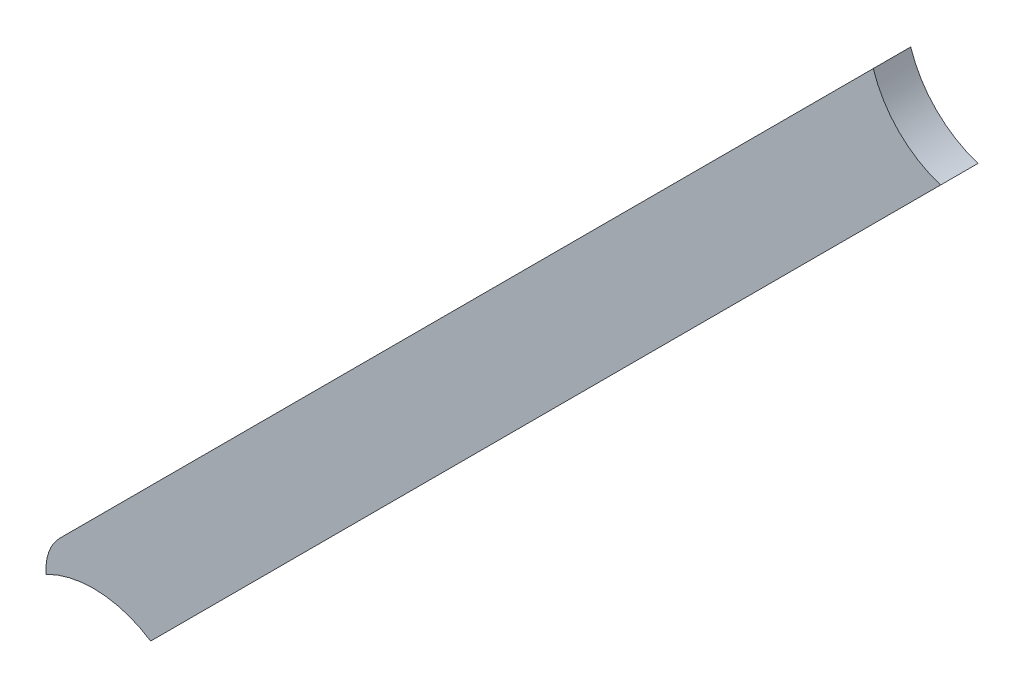
ISO-10303-21;
HEADER;
FILE_DESCRIPTION(('STEP AP214'),'2;1');
FILE_NAME('part.step','',(''),(''),'','','');
FILE_SCHEMA(('AUTOMOTIVE_DESIGN { 1 0 10303 214 1 1 1 1 }'));
ENDSEC;
DATA;
#1=APPLICATION_CONTEXT('core data for automotive mechanical design processes');
#2=APPLICATION_PROTOCOL_DEFINITION('international standard','automotive_design',2000,#1);
#3=PRODUCT_CONTEXT('',#1,'mechanical');
#4=PRODUCT('Part','Part','',(#3));
#5=PRODUCT_RELATED_PRODUCT_CATEGORY('part','',(#4));
#6=PRODUCT_DEFINITION_FORMATION('','',#4);
#7=PRODUCT_DEFINITION_CONTEXT('part definition',#1,'design');
#8=PRODUCT_DEFINITION('design','',#6,#7);
#9=PRODUCT_DEFINITION_SHAPE('','',#8);
#10=(LENGTH_UNIT() NAMED_UNIT(*) SI_UNIT(.MILLI.,.METRE.));
#11=(NAMED_UNIT(*) PLANE_ANGLE_UNIT() SI_UNIT($,.RADIAN.));
#12=(NAMED_UNIT(*) SI_UNIT($,.STERADIAN.) SOLID_ANGLE_UNIT());
#13=UNCERTAINTY_MEASURE_WITH_UNIT(LENGTH_MEASURE(1.E-05),#10,'distance_accuracy_value','');
#14=(GEOMETRIC_REPRESENTATION_CONTEXT(3) GLOBAL_UNCERTAINTY_ASSIGNED_CONTEXT((#13)) GLOBAL_UNIT_ASSIGNED_CONTEXT((#10,
#11,#12)) REPRESENTATION_CONTEXT('',''));
#15=CARTESIAN_POINT('',(0.,0.,0.));
#16=DIRECTION('',(0.,0.,1.));
#17=DIRECTION('',(1.,0.,0.));
#18=AXIS2_PLACEMENT_3D('',#15,#16,#17);
#19=CARTESIAN_POINT('',(109.397777606089,81.2328301260889,0.));
#20=DIRECTION('',(-0.707106781186546,0.707106781186549,0.));
#21=DIRECTION('',(0.707106781186549,0.707106781186546,0.));
#22=AXIS2_PLACEMENT_3D('',#19,#20,#21);
#23=PLANE('',#22);
#24=DIRECTION('',(0.707106781186549,0.707106781186546,0.));
#25=VECTOR('',#24,1.);
#26=CARTESIAN_POINT('',(109.27260594,81.10765846,0.1999996));
#27=LINE('',#26,#25);
#28=CARTESIAN_POINT('',(109.397777606089,81.2328301260889,0.1999996));
#29=VERTEX_POINT('',#28);
#30=CARTESIAN_POINT('',(113.615408458856,85.4504609788559,0.1999996));
#31=VERTEX_POINT('',#30);
#32=EDGE_CURVE('E11',#29,#31,#27,.T.);
#33=ORIENTED_EDGE('',*,*,#32,.F.);
#34=DIRECTION('',(0.,0.,1.));
#35=VECTOR('',#34,1.);
#36=CARTESIAN_POINT('',(109.397777606089,81.2328301260889,0.));
#37=LINE('',#36,#35);
#38=CARTESIAN_POINT('',(109.397777606089,81.2328301260889,0.));
#39=VERTEX_POINT('',#38);
#40=EDGE_CURVE('E24',#39,#29,#37,.T.);
#41=ORIENTED_EDGE('',*,*,#40,.F.);
#42=DIRECTION('',(0.707106781186549,0.707106781186546,0.));
#43=VECTOR('',#42,1.);
#44=CARTESIAN_POINT('',(109.27260594,81.10765846,0.));
#45=LINE('',#44,#43);
#46=CARTESIAN_POINT('',(113.615408458856,85.4504609788559,0.));
#47=VERTEX_POINT('',#46);
#48=EDGE_CURVE('E82',#39,#47,#45,.T.);
#49=ORIENTED_EDGE('',*,*,#48,.T.);
#50=DIRECTION('',(0.,0.,1.));
#51=VECTOR('',#50,1.);
#52=CARTESIAN_POINT('',(113.615408458856,85.4504609788559,0.));
#53=LINE('',#52,#51);
#54=EDGE_CURVE('E37',#47,#31,#53,.T.);
#55=ORIENTED_EDGE('',*,*,#54,.T.);
#56=EDGE_LOOP('',(#33,#41,#49,#55));
#57=FACE_BOUND('',#56,.T.);
#58=ADVANCED_FACE('F17',(#57),#23,.F.);
#59=CARTESIAN_POINT('',(113.7847356,85.979,0.));
#60=DIRECTION('',(0.,0.,-1.));
#61=DIRECTION('',(1.,0.,0.));
#62=AXIS2_PLACEMENT_3D('',#59,#60,#61);
#63=CYLINDRICAL_SURFACE('',#62,0.55500016);
#64=DIRECTION('',(0.,0.,1.));
#65=VECTOR('',#64,1.);
#66=CARTESIAN_POINT('',(113.256196578856,85.8096728588559,0.));
#67=LINE('',#66,#65);
#68=CARTESIAN_POINT('',(113.256196578856,85.8096728588559,0.));
#69=VERTEX_POINT('',#68);
#70=CARTESIAN_POINT('',(113.256196578856,85.8096728588559,0.1999996));
#71=VERTEX_POINT('',#70);
#72=EDGE_CURVE('E98',#69,#71,#67,.T.);
#73=ORIENTED_EDGE('',*,*,#72,.T.);
#74=CARTESIAN_POINT('',(113.7847356,85.979,0.1999996));
#75=DIRECTION('',(0.,0.,1.));
#76=DIRECTION('',(1.,0.,0.));
#77=AXIS2_PLACEMENT_3D('',#74,#75,#76);
#78=CIRCLE('',#77,0.55500016);
#79=EDGE_CURVE('E95',#71,#31,#78,.T.);
#80=ORIENTED_EDGE('',*,*,#79,.T.);
#81=ORIENTED_EDGE('',*,*,#54,.F.);
#82=CARTESIAN_POINT('',(113.7847356,85.979,0.));
#83=DIRECTION('',(0.,0.,1.));
#84=DIRECTION('',(1.,0.,0.));
#85=AXIS2_PLACEMENT_3D('',#82,#83,#84);
#86=CIRCLE('',#85,0.55500016);
#87=EDGE_CURVE('E93',#69,#47,#86,.T.);
#88=ORIENTED_EDGE('',*,*,#87,.F.);
#89=EDGE_LOOP('',(#73,#80,#81,#88));
#90=FACE_BOUND('',#89,.T.);
#91=ADVANCED_FACE('F103',(#90),#63,.F.);
#92=CARTESIAN_POINT('',(113.256196578856,85.8096728588559,0.));
#93=DIRECTION('',(0.707106781186545,-0.70710678118655,0.));
#94=DIRECTION('',(-0.70710678118655,-0.707106781186545,0.));
#95=AXIS2_PLACEMENT_3D('',#92,#93,#94);
#96=PLANE('',#95);
#97=DIRECTION('',(-0.70710678118655,-0.707106781186545,0.));
#98=VECTOR('',#97,1.);
#99=CARTESIAN_POINT('',(113.60512966,86.15860594,0.1999996));
#100=LINE('',#99,#98);
#101=CARTESIAN_POINT('',(108.91339406,81.46687034,0.1999996));
#102=VERTEX_POINT('',#101);
#103=EDGE_CURVE('E90',#71,#102,#100,.T.);
#104=ORIENTED_EDGE('',*,*,#103,.F.);
#105=ORIENTED_EDGE('',*,*,#72,.F.);
#106=DIRECTION('',(-0.70710678118655,-0.707106781186545,0.));
#107=VECTOR('',#106,1.);
#108=CARTESIAN_POINT('',(113.60512966,86.15860594,0.));
#109=LINE('',#108,#107);
#110=CARTESIAN_POINT('',(108.91339406,81.46687034,0.));
#111=VERTEX_POINT('',#110);
#112=EDGE_CURVE('E88',#69,#111,#109,.T.);
#113=ORIENTED_EDGE('',*,*,#112,.T.);
#114=DIRECTION('',(0.,0.,1.));
#115=VECTOR('',#114,1.);
#116=CARTESIAN_POINT('',(108.91339406,81.46687034,0.));
#117=LINE('',#116,#115);
#118=EDGE_CURVE('E73',#111,#102,#117,.T.);
#119=ORIENTED_EDGE('',*,*,#118,.T.);
#120=EDGE_LOOP('',(#104,#105,#113,#119));
#121=FACE_BOUND('',#120,.T.);
#122=ADVANCED_FACE('F109',(#121),#96,.F.);
#123=CARTESIAN_POINT('',(109.093,81.2872644,0.));
#124=DIRECTION('',(0.,0.,-1.));
#125=DIRECTION('',(-0.707106781186548,0.707106781186548,0.));
#126=AXIS2_PLACEMENT_3D('',#123,#124,#125);
#127=CYLINDRICAL_SURFACE('',#126,0.254001156230771);
#128=CARTESIAN_POINT('',(109.093,81.2872644,0.1999996));
#129=DIRECTION('',(0.,0.,1.));
#130=DIRECTION('',(-0.707106781186548,0.707106781186548,0.));
#131=AXIS2_PLACEMENT_3D('',#128,#129,#130);
#132=CIRCLE('',#131,0.254001156230771);
#133=CARTESIAN_POINT('',(108.840154544534,81.2630618584639,0.1999996));
#134=VERTEX_POINT('',#133);
#135=EDGE_CURVE('E77',#102,#134,#132,.T.);
#136=ORIENTED_EDGE('',*,*,#135,.F.);
#137=ORIENTED_EDGE('',*,*,#118,.F.);
#138=CARTESIAN_POINT('',(109.093,81.2872644,0.));
#139=DIRECTION('',(0.,0.,1.));
#140=DIRECTION('',(-0.707106781186548,0.707106781186548,0.));
#141=AXIS2_PLACEMENT_3D('',#138,#139,#140);
#142=CIRCLE('',#141,0.254001156230771);
#143=CARTESIAN_POINT('',(108.840154544534,81.2630618584639,0.));
#144=VERTEX_POINT('',#143);
#145=EDGE_CURVE('E69',#111,#144,#142,.T.);
#146=ORIENTED_EDGE('',*,*,#145,.T.);
#147=DIRECTION('',(0.,0.,1.));
#148=VECTOR('',#147,1.);
#149=CARTESIAN_POINT('',(108.840154544534,81.2630618584639,0.));
#150=LINE('',#149,#148);
#151=EDGE_CURVE('E59',#144,#134,#150,.T.);
#152=ORIENTED_EDGE('',*,*,#151,.T.);
#153=EDGE_LOOP('',(#136,#137,#146,#152));
#154=FACE_BOUND('',#153,.T.);
#155=ADVANCED_FACE('F72',(#154),#127,.T.);
#156=CARTESIAN_POINT('',(109.093,80.7690028,0.));
#157=DIRECTION('',(0.,0.,-1.));
#158=DIRECTION('',(1.,0.,0.));
#159=AXIS2_PLACEMENT_3D('',#156,#157,#158);
#160=CYLINDRICAL_SURFACE('',#159,0.55500016);
#161=ORIENTED_EDGE('',*,*,#40,.T.);
#162=CARTESIAN_POINT('',(109.093,80.7690028,0.1999996));
#163=DIRECTION('',(0.,0.,1.));
#164=DIRECTION('',(1.,0.,0.));
#165=AXIS2_PLACEMENT_3D('',#162,#163,#164);
#166=CIRCLE('',#165,0.55500016);
#167=EDGE_CURVE('E65',#29,#134,#166,.T.);
#168=ORIENTED_EDGE('',*,*,#167,.T.);
#169=ORIENTED_EDGE('',*,*,#151,.F.);
#170=CARTESIAN_POINT('',(109.093,80.7690028,0.));
#171=DIRECTION('',(0.,0.,1.));
#172=DIRECTION('',(1.,0.,0.));
#173=AXIS2_PLACEMENT_3D('',#170,#171,#172);
#174=CIRCLE('',#173,0.55500016);
#175=EDGE_CURVE('E63',#39,#144,#174,.T.);
#176=ORIENTED_EDGE('',*,*,#175,.F.);
#177=EDGE_LOOP('',(#161,#168,#169,#176));
#178=FACE_BOUND('',#177,.T.);
#179=ADVANCED_FACE('F61',(#178),#160,.F.);
#180=CARTESIAN_POINT('',(109.27260594,81.10765846,0.));
#181=DIRECTION('',(0.,0.,-1.));
#182=DIRECTION('',(-1.,0.,0.));
#183=AXIS2_PLACEMENT_3D('',#180,#181,#182);
#184=PLANE('',#183);
#185=ORIENTED_EDGE('',*,*,#48,.F.);
#186=ORIENTED_EDGE('',*,*,#175,.T.);
#187=ORIENTED_EDGE('',*,*,#145,.F.);
#188=ORIENTED_EDGE('',*,*,#112,.F.);
#189=ORIENTED_EDGE('',*,*,#87,.T.);
#190=EDGE_LOOP('',(#185,#186,#187,#188,#189));
#191=FACE_BOUND('',#190,.T.);
#192=ADVANCED_FACE('F80',(#191),#184,.T.);
#193=CARTESIAN_POINT('',(109.27260594,81.10765846,0.1999996));
#194=DIRECTION('',(0.,0.,-1.));
#195=DIRECTION('',(-1.,0.,0.));
#196=AXIS2_PLACEMENT_3D('',#193,#194,#195);
#197=PLANE('',#196);
#198=ORIENTED_EDGE('',*,*,#167,.F.);
#199=ORIENTED_EDGE('',*,*,#32,.T.);
#200=ORIENTED_EDGE('',*,*,#79,.F.);
#201=ORIENTED_EDGE('',*,*,#103,.T.);
#202=ORIENTED_EDGE('',*,*,#135,.T.);
#203=EDGE_LOOP('',(#198,#199,#200,#201,#202));
#204=FACE_BOUND('',#203,.T.);
#205=ADVANCED_FACE('F107',(#204),#197,.F.);
#206=CLOSED_SHELL('',(#58,#91,#122,#155,#179,#192,#205));
#207=MANIFOLD_SOLID_BREP('B1',#206);
#208=ADVANCED_BREP_SHAPE_REPRESENTATION('',(#18,#207),#14);
#209=SHAPE_DEFINITION_REPRESENTATION(#9,#208);
ENDSEC;
END-ISO-10303-21;
